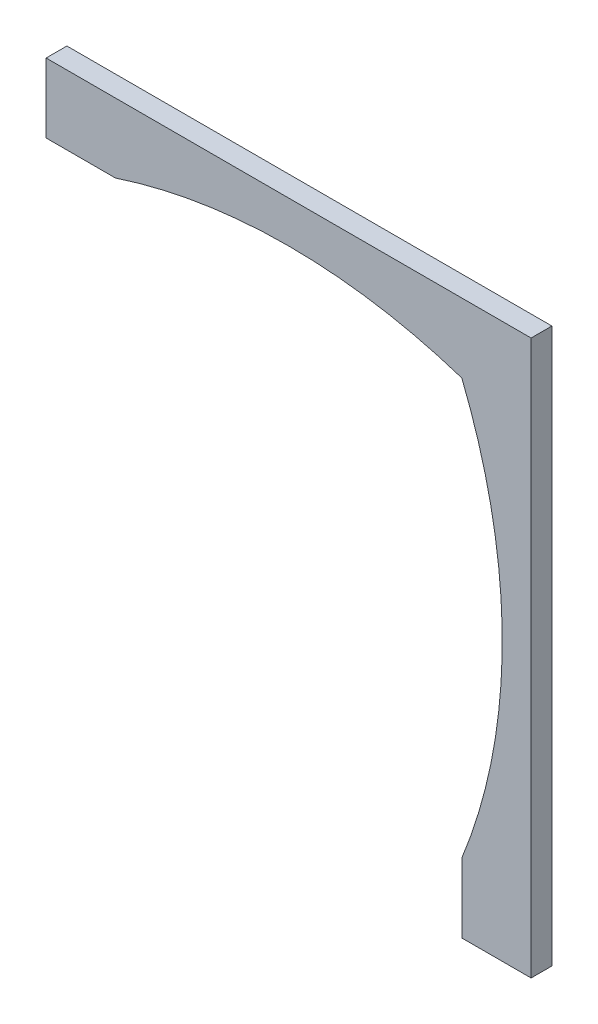
ISO-10303-21;
HEADER;
FILE_DESCRIPTION(('STEP AP214'),'2;1');
FILE_NAME('part.step','',(''),(''),'','','');
FILE_SCHEMA(('AUTOMOTIVE_DESIGN { 1 0 10303 214 1 1 1 1 }'));
ENDSEC;
DATA;
#1=APPLICATION_CONTEXT('core data for automotive mechanical design processes');
#2=APPLICATION_PROTOCOL_DEFINITION('international standard','automotive_design',2000,#1);
#3=PRODUCT_CONTEXT('',#1,'mechanical');
#4=PRODUCT('Part','Part','',(#3));
#5=PRODUCT_RELATED_PRODUCT_CATEGORY('part','',(#4));
#6=PRODUCT_DEFINITION_FORMATION('','',#4);
#7=PRODUCT_DEFINITION_CONTEXT('part definition',#1,'design');
#8=PRODUCT_DEFINITION('design','',#6,#7);
#9=PRODUCT_DEFINITION_SHAPE('','',#8);
#10=(LENGTH_UNIT() NAMED_UNIT(*) SI_UNIT(.MILLI.,.METRE.));
#11=(NAMED_UNIT(*) PLANE_ANGLE_UNIT() SI_UNIT($,.RADIAN.));
#12=(NAMED_UNIT(*) SI_UNIT($,.STERADIAN.) SOLID_ANGLE_UNIT());
#13=UNCERTAINTY_MEASURE_WITH_UNIT(LENGTH_MEASURE(1.E-05),#10,'distance_accuracy_value','');
#14=(GEOMETRIC_REPRESENTATION_CONTEXT(3) GLOBAL_UNCERTAINTY_ASSIGNED_CONTEXT((#13)) GLOBAL_UNIT_ASSIGNED_CONTEXT((#10,
#11,#12)) REPRESENTATION_CONTEXT('',''));
#15=CARTESIAN_POINT('',(0.,0.,0.));
#16=DIRECTION('',(0.,0.,1.));
#17=DIRECTION('',(1.,0.,0.));
#18=AXIS2_PLACEMENT_3D('',#15,#16,#17);
#19=CARTESIAN_POINT('',(0.,0.,3.));
#20=DIRECTION('',(-1.,0.,0.));
#21=DIRECTION('',(0.,0.,1.));
#22=AXIS2_PLACEMENT_3D('',#19,#20,#21);
#23=PLANE('',#22);
#24=DIRECTION('',(0.,1.,0.));
#25=VECTOR('',#24,1.);
#26=CARTESIAN_POINT('',(0.,0.,0.));
#27=LINE('',#26,#25);
#28=CARTESIAN_POINT('',(0.,-80.,0.));
#29=VERTEX_POINT('',#28);
#30=CARTESIAN_POINT('',(0.,0.,0.));
#31=VERTEX_POINT('',#30);
#32=EDGE_CURVE('E135',#29,#31,#27,.T.);
#33=ORIENTED_EDGE('',*,*,#32,.T.);
#34=DIRECTION('',(0.,0.,-1.));
#35=VECTOR('',#34,1.);
#36=CARTESIAN_POINT('',(0.,0.,3.));
#37=LINE('',#36,#35);
#38=CARTESIAN_POINT('',(0.,0.,3.));
#39=VERTEX_POINT('',#38);
#40=EDGE_CURVE('E11',#39,#31,#37,.T.);
#41=ORIENTED_EDGE('',*,*,#40,.F.);
#42=DIRECTION('',(0.,1.,0.));
#43=VECTOR('',#42,1.);
#44=CARTESIAN_POINT('',(0.,0.,3.));
#45=LINE('',#44,#43);
#46=CARTESIAN_POINT('',(0.,-80.,3.));
#47=VERTEX_POINT('',#46);
#48=EDGE_CURVE('E149',#47,#39,#45,.T.);
#49=ORIENTED_EDGE('',*,*,#48,.F.);
#50=DIRECTION('',(0.,0.,-1.));
#51=VECTOR('',#50,1.);
#52=CARTESIAN_POINT('',(0.,-80.,3.));
#53=LINE('',#52,#51);
#54=EDGE_CURVE('E131',#47,#29,#53,.T.);
#55=ORIENTED_EDGE('',*,*,#54,.T.);
#56=EDGE_LOOP('',(#33,#41,#49,#55));
#57=FACE_BOUND('',#56,.T.);
#58=ADVANCED_FACE('F39',(#57),#23,.F.);
#59=CARTESIAN_POINT('',(0.,0.,3.));
#60=DIRECTION('',(0.,-1.,0.));
#61=DIRECTION('',(0.,0.,-1.));
#62=AXIS2_PLACEMENT_3D('',#59,#60,#61);
#63=PLANE('',#62);
#64=DIRECTION('',(-1.,0.,0.));
#65=VECTOR('',#64,1.);
#66=CARTESIAN_POINT('',(0.,0.,0.));
#67=LINE('',#66,#65);
#68=CARTESIAN_POINT('',(-70.,0.,0.));
#69=VERTEX_POINT('',#68);
#70=EDGE_CURVE('E138',#31,#69,#67,.T.);
#71=ORIENTED_EDGE('',*,*,#70,.T.);
#72=DIRECTION('',(0.,0.,-1.));
#73=VECTOR('',#72,1.);
#74=CARTESIAN_POINT('',(-70.,0.,3.));
#75=LINE('',#74,#73);
#76=CARTESIAN_POINT('',(-70.,0.,3.));
#77=VERTEX_POINT('',#76);
#78=EDGE_CURVE('E47',#77,#69,#75,.T.);
#79=ORIENTED_EDGE('',*,*,#78,.F.);
#80=DIRECTION('',(-1.,0.,0.));
#81=VECTOR('',#80,1.);
#82=CARTESIAN_POINT('',(0.,0.,3.));
#83=LINE('',#82,#81);
#84=EDGE_CURVE('E98',#39,#77,#83,.T.);
#85=ORIENTED_EDGE('',*,*,#84,.F.);
#86=ORIENTED_EDGE('',*,*,#40,.T.);
#87=EDGE_LOOP('',(#71,#79,#85,#86));
#88=FACE_BOUND('',#87,.T.);
#89=ADVANCED_FACE('F184',(#88),#63,.F.);
#90=CARTESIAN_POINT('',(-70.,0.,3.));
#91=DIRECTION('',(1.,0.,0.));
#92=DIRECTION('',(0.,0.,-1.));
#93=AXIS2_PLACEMENT_3D('',#90,#91,#92);
#94=PLANE('',#93);
#95=DIRECTION('',(0.,-1.,0.));
#96=VECTOR('',#95,1.);
#97=CARTESIAN_POINT('',(-70.,0.,0.));
#98=LINE('',#97,#96);
#99=CARTESIAN_POINT('',(-70.,-10.,0.));
#100=VERTEX_POINT('',#99);
#101=EDGE_CURVE('E140',#69,#100,#98,.T.);
#102=ORIENTED_EDGE('',*,*,#101,.T.);
#103=DIRECTION('',(0.,0.,-1.));
#104=VECTOR('',#103,1.);
#105=CARTESIAN_POINT('',(-70.,-10.,3.));
#106=LINE('',#105,#104);
#107=CARTESIAN_POINT('',(-70.,-10.,3.));
#108=VERTEX_POINT('',#107);
#109=EDGE_CURVE('E156',#108,#100,#106,.T.);
#110=ORIENTED_EDGE('',*,*,#109,.F.);
#111=DIRECTION('',(0.,-1.,0.));
#112=VECTOR('',#111,1.);
#113=CARTESIAN_POINT('',(-70.,0.,3.));
#114=LINE('',#113,#112);
#115=EDGE_CURVE('E164',#77,#108,#114,.T.);
#116=ORIENTED_EDGE('',*,*,#115,.F.);
#117=ORIENTED_EDGE('',*,*,#78,.T.);
#118=EDGE_LOOP('',(#102,#110,#116,#117));
#119=FACE_BOUND('',#118,.T.);
#120=ADVANCED_FACE('F162',(#119),#94,.F.);
#121=CARTESIAN_POINT('',(-70.,-10.,3.));
#122=DIRECTION('',(0.,1.,0.));
#123=DIRECTION('',(0.,0.,1.));
#124=AXIS2_PLACEMENT_3D('',#121,#122,#123);
#125=PLANE('',#124);
#126=DIRECTION('',(1.,0.,0.));
#127=VECTOR('',#126,1.);
#128=CARTESIAN_POINT('',(-70.,-10.,0.));
#129=LINE('',#128,#127);
#130=CARTESIAN_POINT('',(-60.,-10.,0.));
#131=VERTEX_POINT('',#130);
#132=EDGE_CURVE('E142',#100,#131,#129,.T.);
#133=ORIENTED_EDGE('',*,*,#132,.T.);
#134=DIRECTION('',(0.,0.,-1.));
#135=VECTOR('',#134,1.);
#136=CARTESIAN_POINT('',(-60.,-10.,3.));
#137=LINE('',#136,#135);
#138=CARTESIAN_POINT('',(-60.,-10.,3.));
#139=VERTEX_POINT('',#138);
#140=EDGE_CURVE('E153',#139,#131,#137,.T.);
#141=ORIENTED_EDGE('',*,*,#140,.F.);
#142=DIRECTION('',(1.,0.,0.));
#143=VECTOR('',#142,1.);
#144=CARTESIAN_POINT('',(-70.,-10.,3.));
#145=LINE('',#144,#143);
#146=EDGE_CURVE('E176',#108,#139,#145,.T.);
#147=ORIENTED_EDGE('',*,*,#146,.F.);
#148=ORIENTED_EDGE('',*,*,#109,.T.);
#149=EDGE_LOOP('',(#133,#141,#147,#148));
#150=FACE_BOUND('',#149,.T.);
#151=ADVANCED_FACE('F172',(#150),#125,.F.);
#152=CARTESIAN_POINT('',(-35.,-85.9934207678533,3.));
#153=DIRECTION('',(0.,0.,-1.));
#154=DIRECTION('',(-1.,0.,0.));
#155=AXIS2_PLACEMENT_3D('',#152,#153,#154);
#156=CYLINDRICAL_SURFACE('',#155,80.);
#157=CARTESIAN_POINT('',(-35.,-85.9934207678533,0.));
#158=DIRECTION('',(0.,0.,-1.));
#159=DIRECTION('',(1.,0.,0.));
#160=AXIS2_PLACEMENT_3D('',#157,#158,#159);
#161=CIRCLE('',#160,80.);
#162=CARTESIAN_POINT('',(-9.99999999999999,-9.99999999999999,0.));
#163=VERTEX_POINT('',#162);
#164=EDGE_CURVE('E144',#131,#163,#161,.T.);
#165=ORIENTED_EDGE('',*,*,#164,.T.);
#166=DIRECTION('',(0.,0.,-1.));
#167=VECTOR('',#166,1.);
#168=CARTESIAN_POINT('',(-9.99999999999999,-9.99999999999999,3.));
#169=LINE('',#168,#167);
#170=CARTESIAN_POINT('',(-9.99999999999999,-9.99999999999999,3.));
#171=VERTEX_POINT('',#170);
#172=EDGE_CURVE('E126',#171,#163,#169,.T.);
#173=ORIENTED_EDGE('',*,*,#172,.F.);
#174=CARTESIAN_POINT('',(-35.,-85.9934207678533,3.));
#175=DIRECTION('',(0.,0.,-1.));
#176=DIRECTION('',(1.,0.,0.));
#177=AXIS2_PLACEMENT_3D('',#174,#175,#176);
#178=CIRCLE('',#177,80.);
#179=EDGE_CURVE('E117',#139,#171,#178,.T.);
#180=ORIENTED_EDGE('',*,*,#179,.F.);
#181=ORIENTED_EDGE('',*,*,#140,.T.);
#182=EDGE_LOOP('',(#165,#173,#180,#181));
#183=FACE_BOUND('',#182,.T.);
#184=ADVANCED_FACE('F175',(#183),#156,.F.);
#185=CARTESIAN_POINT('',(-84.1619848709566,-40.,3.));
#186=DIRECTION('',(0.,0.,-1.));
#187=DIRECTION('',(-1.,0.,0.));
#188=AXIS2_PLACEMENT_3D('',#185,#186,#187);
#189=CYLINDRICAL_SURFACE('',#188,80.);
#190=CARTESIAN_POINT('',(-84.1619848709566,-40.,0.));
#191=DIRECTION('',(0.,0.,-1.));
#192=DIRECTION('',(-1.,0.,0.));
#193=AXIS2_PLACEMENT_3D('',#190,#191,#192);
#194=CIRCLE('',#193,80.);
#195=CARTESIAN_POINT('',(-9.99999999999998,-70.,0.));
#196=VERTEX_POINT('',#195);
#197=EDGE_CURVE('E125',#163,#196,#194,.T.);
#198=ORIENTED_EDGE('',*,*,#197,.T.);
#199=DIRECTION('',(0.,0.,-1.));
#200=VECTOR('',#199,1.);
#201=CARTESIAN_POINT('',(-9.99999999999998,-70.,3.));
#202=LINE('',#201,#200);
#203=CARTESIAN_POINT('',(-9.99999999999998,-70.,3.));
#204=VERTEX_POINT('',#203);
#205=EDGE_CURVE('E122',#204,#196,#202,.T.);
#206=ORIENTED_EDGE('',*,*,#205,.F.);
#207=CARTESIAN_POINT('',(-84.1619848709566,-40.,3.));
#208=DIRECTION('',(0.,0.,-1.));
#209=DIRECTION('',(-1.,0.,0.));
#210=AXIS2_PLACEMENT_3D('',#207,#208,#209);
#211=CIRCLE('',#210,80.);
#212=EDGE_CURVE('E111',#171,#204,#211,.T.);
#213=ORIENTED_EDGE('',*,*,#212,.F.);
#214=ORIENTED_EDGE('',*,*,#172,.T.);
#215=EDGE_LOOP('',(#198,#206,#213,#214));
#216=FACE_BOUND('',#215,.T.);
#217=ADVANCED_FACE('F123',(#216),#189,.F.);
#218=CARTESIAN_POINT('',(-10.,-80.,3.));
#219=DIRECTION('',(1.,0.,0.));
#220=DIRECTION('',(0.,0.,-1.));
#221=AXIS2_PLACEMENT_3D('',#218,#219,#220);
#222=PLANE('',#221);
#223=DIRECTION('',(0.,-1.,0.));
#224=VECTOR('',#223,1.);
#225=CARTESIAN_POINT('',(-10.,-80.,0.));
#226=LINE('',#225,#224);
#227=CARTESIAN_POINT('',(-10.,-80.,0.));
#228=VERTEX_POINT('',#227);
#229=EDGE_CURVE('E84',#196,#228,#226,.T.);
#230=ORIENTED_EDGE('',*,*,#229,.T.);
#231=DIRECTION('',(0.,0.,-1.));
#232=VECTOR('',#231,1.);
#233=CARTESIAN_POINT('',(-10.,-80.,3.));
#234=LINE('',#233,#232);
#235=CARTESIAN_POINT('',(-10.,-80.,3.));
#236=VERTEX_POINT('',#235);
#237=EDGE_CURVE('E127',#236,#228,#234,.T.);
#238=ORIENTED_EDGE('',*,*,#237,.F.);
#239=DIRECTION('',(0.,-1.,0.));
#240=VECTOR('',#239,1.);
#241=CARTESIAN_POINT('',(-10.,-80.,3.));
#242=LINE('',#241,#240);
#243=EDGE_CURVE('E115',#204,#236,#242,.T.);
#244=ORIENTED_EDGE('',*,*,#243,.F.);
#245=ORIENTED_EDGE('',*,*,#205,.T.);
#246=EDGE_LOOP('',(#230,#238,#244,#245));
#247=FACE_BOUND('',#246,.T.);
#248=ADVANCED_FACE('F129',(#247),#222,.F.);
#249=CARTESIAN_POINT('',(0.,-80.,3.));
#250=DIRECTION('',(0.,1.,0.));
#251=DIRECTION('',(0.,0.,1.));
#252=AXIS2_PLACEMENT_3D('',#249,#250,#251);
#253=PLANE('',#252);
#254=DIRECTION('',(1.,0.,0.));
#255=VECTOR('',#254,1.);
#256=CARTESIAN_POINT('',(0.,-80.,0.));
#257=LINE('',#256,#255);
#258=EDGE_CURVE('E90',#228,#29,#257,.T.);
#259=ORIENTED_EDGE('',*,*,#258,.T.);
#260=ORIENTED_EDGE('',*,*,#54,.F.);
#261=DIRECTION('',(1.,0.,0.));
#262=VECTOR('',#261,1.);
#263=CARTESIAN_POINT('',(0.,-80.,3.));
#264=LINE('',#263,#262);
#265=EDGE_CURVE('E55',#236,#47,#264,.T.);
#266=ORIENTED_EDGE('',*,*,#265,.F.);
#267=ORIENTED_EDGE('',*,*,#237,.T.);
#268=EDGE_LOOP('',(#259,#260,#266,#267));
#269=FACE_BOUND('',#268,.T.);
#270=ADVANCED_FACE('F200',(#269),#253,.F.);
#271=CARTESIAN_POINT('',(-84.1619848709566,-40.,3.));
#272=DIRECTION('',(0.,0.,-1.));
#273=DIRECTION('',(-1.,0.,0.));
#274=AXIS2_PLACEMENT_3D('',#271,#272,#273);
#275=PLANE('',#274);
#276=ORIENTED_EDGE('',*,*,#48,.T.);
#277=ORIENTED_EDGE('',*,*,#84,.T.);
#278=ORIENTED_EDGE('',*,*,#115,.T.);
#279=ORIENTED_EDGE('',*,*,#146,.T.);
#280=ORIENTED_EDGE('',*,*,#179,.T.);
#281=ORIENTED_EDGE('',*,*,#212,.T.);
#282=ORIENTED_EDGE('',*,*,#243,.T.);
#283=ORIENTED_EDGE('',*,*,#265,.T.);
#284=EDGE_LOOP('',(#276,#277,#278,#279,#280,#281,#282,#283));
#285=FACE_BOUND('',#284,.T.);
#286=ADVANCED_FACE('F113',(#285),#275,.F.);
#287=CARTESIAN_POINT('',(-84.1619848709566,-40.,0.));
#288=DIRECTION('',(0.,0.,-1.));
#289=DIRECTION('',(-1.,0.,0.));
#290=AXIS2_PLACEMENT_3D('',#287,#288,#289);
#291=PLANE('',#290);
#292=ORIENTED_EDGE('',*,*,#32,.F.);
#293=ORIENTED_EDGE('',*,*,#258,.F.);
#294=ORIENTED_EDGE('',*,*,#229,.F.);
#295=ORIENTED_EDGE('',*,*,#197,.F.);
#296=ORIENTED_EDGE('',*,*,#164,.F.);
#297=ORIENTED_EDGE('',*,*,#132,.F.);
#298=ORIENTED_EDGE('',*,*,#101,.F.);
#299=ORIENTED_EDGE('',*,*,#70,.F.);
#300=EDGE_LOOP('',(#292,#293,#294,#295,#296,#297,#298,#299));
#301=FACE_BOUND('',#300,.T.);
#302=ADVANCED_FACE('F168',(#301),#291,.T.);
#303=CLOSED_SHELL('',(#58,#89,#120,#151,#184,#217,#248,#270,#286,#302));
#304=MANIFOLD_SOLID_BREP('B2',#303);
#305=ADVANCED_BREP_SHAPE_REPRESENTATION('',(#18,#304),#14);
#306=SHAPE_DEFINITION_REPRESENTATION(#9,#305);
ENDSEC;
END-ISO-10303-21;
